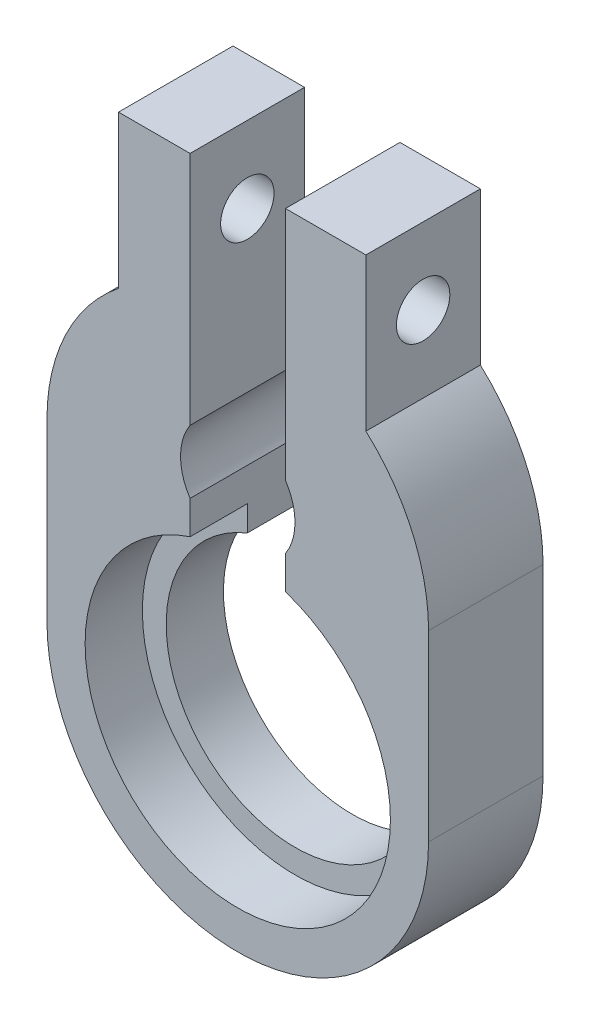
ISO-10303-21;
HEADER;
FILE_DESCRIPTION(('STEP AP214'),'2;1');
FILE_NAME('part.step','',(''),(''),'','','');
FILE_SCHEMA(('AUTOMOTIVE_DESIGN { 1 0 10303 214 1 1 1 1 }'));
ENDSEC;
DATA;
#1=APPLICATION_CONTEXT('core data for automotive mechanical design processes');
#2=APPLICATION_PROTOCOL_DEFINITION('international standard','automotive_design',2000,#1);
#3=PRODUCT_CONTEXT('',#1,'mechanical');
#4=PRODUCT('Part','Part','',(#3));
#5=PRODUCT_RELATED_PRODUCT_CATEGORY('part','',(#4));
#6=PRODUCT_DEFINITION_FORMATION('','',#4);
#7=PRODUCT_DEFINITION_CONTEXT('part definition',#1,'design');
#8=PRODUCT_DEFINITION('design','',#6,#7);
#9=PRODUCT_DEFINITION_SHAPE('','',#8);
#10=(LENGTH_UNIT() NAMED_UNIT(*) SI_UNIT(.MILLI.,.METRE.));
#11=(NAMED_UNIT(*) PLANE_ANGLE_UNIT() SI_UNIT($,.RADIAN.));
#12=(NAMED_UNIT(*) SI_UNIT($,.STERADIAN.) SOLID_ANGLE_UNIT());
#13=UNCERTAINTY_MEASURE_WITH_UNIT(LENGTH_MEASURE(1.E-05),#10,'distance_accuracy_value','');
#14=(GEOMETRIC_REPRESENTATION_CONTEXT(3) GLOBAL_UNCERTAINTY_ASSIGNED_CONTEXT((#13)) GLOBAL_UNIT_ASSIGNED_CONTEXT((#10,
#11,#12)) REPRESENTATION_CONTEXT('',''));
#15=CARTESIAN_POINT('',(0.,0.,0.));
#16=DIRECTION('',(0.,0.,1.));
#17=DIRECTION('',(1.,0.,0.));
#18=AXIS2_PLACEMENT_3D('',#15,#16,#17);
#19=CARTESIAN_POINT('',(0.,0.,6.));
#20=DIRECTION('',(0.,0.,-1.));
#21=DIRECTION('',(-1.,0.,0.));
#22=AXIS2_PLACEMENT_3D('',#19,#20,#21);
#23=CYLINDRICAL_SURFACE('',#22,6.75);
#24=CARTESIAN_POINT('',(0.,0.,3.));
#25=DIRECTION('',(0.,0.,1.));
#26=DIRECTION('',(1.,0.,0.));
#27=AXIS2_PLACEMENT_3D('',#24,#25,#26);
#28=CIRCLE('',#27,6.75);
#29=CARTESIAN_POINT('',(2.5,6.26996810199223,3.));
#30=VERTEX_POINT('',#29);
#31=CARTESIAN_POINT('',(-2.50000000000001,6.26996810199222,3.));
#32=VERTEX_POINT('',#31);
#33=EDGE_CURVE('E182',#30,#32,#28,.F.);
#34=ORIENTED_EDGE('',*,*,#33,.F.);
#35=DIRECTION('',(0.,0.,-1.));
#36=VECTOR('',#35,1.);
#37=CARTESIAN_POINT('',(2.5,6.26996810199223,6.));
#38=LINE('',#37,#36);
#39=CARTESIAN_POINT('',(2.5,6.26996810199223,0.));
#40=VERTEX_POINT('',#39);
#41=EDGE_CURVE('E196',#30,#40,#38,.T.);
#42=ORIENTED_EDGE('',*,*,#41,.T.);
#43=CARTESIAN_POINT('',(0.,0.,0.));
#44=DIRECTION('',(0.,0.,-1.));
#45=DIRECTION('',(1.,0.,0.));
#46=AXIS2_PLACEMENT_3D('',#43,#44,#45);
#47=CIRCLE('',#46,6.75);
#48=CARTESIAN_POINT('',(-2.5,6.26996810199222,0.));
#49=VERTEX_POINT('',#48);
#50=EDGE_CURVE('E268',#40,#49,#47,.T.);
#51=ORIENTED_EDGE('',*,*,#50,.T.);
#52=DIRECTION('',(0.,0.,-1.));
#53=VECTOR('',#52,1.);
#54=CARTESIAN_POINT('',(-2.5,6.26996810199222,6.));
#55=LINE('',#54,#53);
#56=EDGE_CURVE('E348',#32,#49,#55,.T.);
#57=ORIENTED_EDGE('',*,*,#56,.F.);
#58=EDGE_LOOP('',(#34,#42,#51,#57));
#59=FACE_BOUND('',#58,.T.);
#60=ADVANCED_FACE('F47',(#59),#23,.F.);
#61=CARTESIAN_POINT('',(0.,11.,6.));
#62=DIRECTION('',(0.,0.,-1.));
#63=DIRECTION('',(-1.,0.,0.));
#64=AXIS2_PLACEMENT_3D('',#61,#62,#63);
#65=CYLINDRICAL_SURFACE('',#64,3.);
#66=CARTESIAN_POINT('',(0.,11.,0.));
#67=DIRECTION('',(0.,0.,-1.));
#68=DIRECTION('',(1.,0.,0.));
#69=AXIS2_PLACEMENT_3D('',#66,#67,#68);
#70=CIRCLE('',#69,3.);
#71=CARTESIAN_POINT('',(2.49999999999999,12.6583123951777,0.));
#72=VERTEX_POINT('',#71);
#73=CARTESIAN_POINT('',(2.5,9.3416876048223,0.));
#74=VERTEX_POINT('',#73);
#75=EDGE_CURVE('E218',#72,#74,#70,.T.);
#76=ORIENTED_EDGE('',*,*,#75,.T.);
#77=DIRECTION('',(0.,0.,-1.));
#78=VECTOR('',#77,1.);
#79=CARTESIAN_POINT('',(2.5,9.3416876048223,6.));
#80=LINE('',#79,#78);
#81=CARTESIAN_POINT('',(2.5,9.3416876048223,6.));
#82=VERTEX_POINT('',#81);
#83=EDGE_CURVE('E353',#82,#74,#80,.T.);
#84=ORIENTED_EDGE('',*,*,#83,.F.);
#85=CARTESIAN_POINT('',(0.,11.,6.));
#86=DIRECTION('',(0.,0.,-1.));
#87=DIRECTION('',(1.,0.,0.));
#88=AXIS2_PLACEMENT_3D('',#85,#86,#87);
#89=CIRCLE('',#88,3.);
#90=CARTESIAN_POINT('',(2.49999999999999,12.6583123951777,6.));
#91=VERTEX_POINT('',#90);
#92=EDGE_CURVE('E219',#91,#82,#89,.T.);
#93=ORIENTED_EDGE('',*,*,#92,.F.);
#94=DIRECTION('',(0.,0.,-1.));
#95=VECTOR('',#94,1.);
#96=CARTESIAN_POINT('',(2.49999999999999,12.6583123951777,6.));
#97=LINE('',#96,#95);
#98=EDGE_CURVE('E261',#91,#72,#97,.T.);
#99=ORIENTED_EDGE('',*,*,#98,.T.);
#100=EDGE_LOOP('',(#76,#84,#93,#99));
#101=FACE_BOUND('',#100,.T.);
#102=ADVANCED_FACE('F420',(#101),#65,.F.);
#103=CARTESIAN_POINT('',(2.5,6.26996810199223,6.));
#104=DIRECTION('',(1.,0.,0.));
#105=DIRECTION('',(0.,0.,-1.));
#106=AXIS2_PLACEMENT_3D('',#103,#104,#105);
#107=PLANE('',#106);
#108=DIRECTION('',(0.,-1.,0.));
#109=VECTOR('',#108,1.);
#110=CARTESIAN_POINT('',(2.5,6.26996810199223,3.));
#111=LINE('',#110,#109);
#112=CARTESIAN_POINT('',(2.5,7.59934207678533,3.));
#113=VERTEX_POINT('',#112);
#114=EDGE_CURVE('E187',#113,#30,#111,.T.);
#115=ORIENTED_EDGE('',*,*,#114,.F.);
#116=DIRECTION('',(0.,0.,1.));
#117=VECTOR('',#116,1.);
#118=CARTESIAN_POINT('',(2.5,7.59934207678533,3.));
#119=LINE('',#118,#117);
#120=CARTESIAN_POINT('',(2.5,7.59934207678533,6.));
#121=VERTEX_POINT('',#120);
#122=EDGE_CURVE('E171',#113,#121,#119,.T.);
#123=ORIENTED_EDGE('',*,*,#122,.T.);
#124=DIRECTION('',(0.,-1.,0.));
#125=VECTOR('',#124,1.);
#126=CARTESIAN_POINT('',(2.5,6.26996810199223,6.));
#127=LINE('',#126,#125);
#128=EDGE_CURVE('E223',#82,#121,#127,.T.);
#129=ORIENTED_EDGE('',*,*,#128,.F.);
#130=ORIENTED_EDGE('',*,*,#83,.T.);
#131=DIRECTION('',(0.,-1.,0.));
#132=VECTOR('',#131,1.);
#133=CARTESIAN_POINT('',(2.5,6.26996810199223,0.));
#134=LINE('',#133,#132);
#135=EDGE_CURVE('E265',#74,#40,#134,.T.);
#136=ORIENTED_EDGE('',*,*,#135,.T.);
#137=ORIENTED_EDGE('',*,*,#41,.F.);
#138=EDGE_LOOP('',(#115,#123,#129,#130,#136,#137));
#139=FACE_BOUND('',#138,.T.);
#140=ADVANCED_FACE('F194',(#139),#107,.F.);
#141=CARTESIAN_POINT('',(-2.50000000000001,6.26996810199222,6.));
#142=DIRECTION('',(-1.,0.,0.));
#143=DIRECTION('',(0.,-1.,0.));
#144=AXIS2_PLACEMENT_3D('',#141,#142,#143);
#145=PLANE('',#144);
#146=DIRECTION('',(0.,1.,0.));
#147=VECTOR('',#146,1.);
#148=CARTESIAN_POINT('',(-2.50000000000001,6.26996810199222,6.));
#149=LINE('',#148,#147);
#150=CARTESIAN_POINT('',(-2.5,7.59934207678533,6.));
#151=VERTEX_POINT('',#150);
#152=CARTESIAN_POINT('',(-2.5,9.3416876048223,6.));
#153=VERTEX_POINT('',#152);
#154=EDGE_CURVE('E227',#151,#153,#149,.T.);
#155=ORIENTED_EDGE('',*,*,#154,.F.);
#156=DIRECTION('',(0.,0.,1.));
#157=VECTOR('',#156,1.);
#158=CARTESIAN_POINT('',(-2.5,7.59934207678533,3.));
#159=LINE('',#158,#157);
#160=CARTESIAN_POINT('',(-2.5,7.59934207678533,3.));
#161=VERTEX_POINT('',#160);
#162=EDGE_CURVE('E183',#151,#161,#159,.F.);
#163=ORIENTED_EDGE('',*,*,#162,.T.);
#164=DIRECTION('',(0.,1.,0.));
#165=VECTOR('',#164,1.);
#166=CARTESIAN_POINT('',(-2.50000000000001,6.26996810199222,3.));
#167=LINE('',#166,#165);
#168=EDGE_CURVE('E190',#32,#161,#167,.T.);
#169=ORIENTED_EDGE('',*,*,#168,.F.);
#170=ORIENTED_EDGE('',*,*,#56,.T.);
#171=DIRECTION('',(0.,1.,0.));
#172=VECTOR('',#171,1.);
#173=CARTESIAN_POINT('',(-2.50000000000001,6.26996810199222,0.));
#174=LINE('',#173,#172);
#175=CARTESIAN_POINT('',(-2.5,9.3416876048223,0.));
#176=VERTEX_POINT('',#175);
#177=EDGE_CURVE('E272',#49,#176,#174,.T.);
#178=ORIENTED_EDGE('',*,*,#177,.T.);
#179=DIRECTION('',(0.,0.,-1.));
#180=VECTOR('',#179,1.);
#181=CARTESIAN_POINT('',(-2.5,9.3416876048223,6.));
#182=LINE('',#181,#180);
#183=EDGE_CURVE('E344',#153,#176,#182,.T.);
#184=ORIENTED_EDGE('',*,*,#183,.F.);
#185=EDGE_LOOP('',(#155,#163,#169,#170,#178,#184));
#186=FACE_BOUND('',#185,.T.);
#187=ADVANCED_FACE('F425',(#186),#145,.F.);
#188=CARTESIAN_POINT('',(0.,11.,6.));
#189=DIRECTION('',(0.,0.,-1.));
#190=DIRECTION('',(-1.,0.,0.));
#191=AXIS2_PLACEMENT_3D('',#188,#189,#190);
#192=CYLINDRICAL_SURFACE('',#191,3.);
#193=CARTESIAN_POINT('',(0.,11.,0.));
#194=DIRECTION('',(0.,0.,-1.));
#195=DIRECTION('',(1.,0.,0.));
#196=AXIS2_PLACEMENT_3D('',#193,#194,#195);
#197=CIRCLE('',#196,3.);
#198=CARTESIAN_POINT('',(-2.50000000000001,12.6583123951777,0.));
#199=VERTEX_POINT('',#198);
#200=EDGE_CURVE('E275',#176,#199,#197,.T.);
#201=ORIENTED_EDGE('',*,*,#200,.T.);
#202=DIRECTION('',(0.,0.,-1.));
#203=VECTOR('',#202,1.);
#204=CARTESIAN_POINT('',(-2.50000000000001,12.6583123951777,6.));
#205=LINE('',#204,#203);
#206=CARTESIAN_POINT('',(-2.50000000000001,12.6583123951777,6.));
#207=VERTEX_POINT('',#206);
#208=EDGE_CURVE('E340',#207,#199,#205,.T.);
#209=ORIENTED_EDGE('',*,*,#208,.F.);
#210=CARTESIAN_POINT('',(0.,11.,6.));
#211=DIRECTION('',(0.,0.,-1.));
#212=DIRECTION('',(1.,0.,0.));
#213=AXIS2_PLACEMENT_3D('',#210,#211,#212);
#214=CIRCLE('',#213,3.);
#215=EDGE_CURVE('E230',#153,#207,#214,.T.);
#216=ORIENTED_EDGE('',*,*,#215,.F.);
#217=ORIENTED_EDGE('',*,*,#183,.T.);
#218=EDGE_LOOP('',(#201,#209,#216,#217));
#219=FACE_BOUND('',#218,.T.);
#220=ADVANCED_FACE('F431',(#219),#192,.F.);
#221=CARTESIAN_POINT('',(-2.50000000000001,12.6583123951777,6.));
#222=DIRECTION('',(-1.,0.,0.));
#223=DIRECTION('',(0.,0.,1.));
#224=AXIS2_PLACEMENT_3D('',#221,#222,#223);
#225=PLANE('',#224);
#226=CARTESIAN_POINT('',(-2.50000000000001,21.,3.));
#227=DIRECTION('',(-1.,0.,0.));
#228=DIRECTION('',(0.,0.,1.));
#229=AXIS2_PLACEMENT_3D('',#226,#227,#228);
#230=CIRCLE('',#229,1.4);
#231=CARTESIAN_POINT('',(-2.50000000000001,21.,1.6));
#232=VERTEX_POINT('',#231);
#233=EDGE_CURVE('E214',#232,#232,#230,.T.);
#234=ORIENTED_EDGE('',*,*,#233,.T.);
#235=EDGE_LOOP('',(#234));
#236=FACE_BOUND('',#235,.T.);
#237=DIRECTION('',(0.,1.,0.));
#238=VECTOR('',#237,1.);
#239=CARTESIAN_POINT('',(-2.50000000000001,12.6583123951777,0.));
#240=LINE('',#239,#238);
#241=CARTESIAN_POINT('',(-2.50000000000001,25.,0.));
#242=VERTEX_POINT('',#241);
#243=EDGE_CURVE('E278',#199,#242,#240,.T.);
#244=ORIENTED_EDGE('',*,*,#243,.T.);
#245=DIRECTION('',(0.,0.,-1.));
#246=VECTOR('',#245,1.);
#247=CARTESIAN_POINT('',(-2.50000000000001,25.,6.));
#248=LINE('',#247,#246);
#249=CARTESIAN_POINT('',(-2.50000000000001,25.,6.));
#250=VERTEX_POINT('',#249);
#251=EDGE_CURVE('E336',#250,#242,#248,.T.);
#252=ORIENTED_EDGE('',*,*,#251,.F.);
#253=DIRECTION('',(0.,1.,0.));
#254=VECTOR('',#253,1.);
#255=CARTESIAN_POINT('',(-2.50000000000001,12.6583123951777,6.));
#256=LINE('',#255,#254);
#257=EDGE_CURVE('E233',#207,#250,#256,.T.);
#258=ORIENTED_EDGE('',*,*,#257,.F.);
#259=ORIENTED_EDGE('',*,*,#208,.T.);
#260=EDGE_LOOP('',(#244,#252,#258,#259));
#261=FACE_BOUND('',#260,.T.);
#262=ADVANCED_FACE('F436',(#236,#261),#225,.F.);
#263=CARTESIAN_POINT('',(-6.25000000000003,25.,6.));
#264=DIRECTION('',(0.,-1.,0.));
#265=DIRECTION('',(0.,0.,-1.));
#266=AXIS2_PLACEMENT_3D('',#263,#264,#265);
#267=PLANE('',#266);
#268=DIRECTION('',(-1.,0.,0.));
#269=VECTOR('',#268,1.);
#270=CARTESIAN_POINT('',(-6.25000000000003,25.,0.));
#271=LINE('',#270,#269);
#272=CARTESIAN_POINT('',(-6.25000000000003,25.,0.));
#273=VERTEX_POINT('',#272);
#274=EDGE_CURVE('E281',#242,#273,#271,.T.);
#275=ORIENTED_EDGE('',*,*,#274,.T.);
#276=DIRECTION('',(0.,0.,-1.));
#277=VECTOR('',#276,1.);
#278=CARTESIAN_POINT('',(-6.25000000000003,25.,6.));
#279=LINE('',#278,#277);
#280=CARTESIAN_POINT('',(-6.25000000000003,25.,6.));
#281=VERTEX_POINT('',#280);
#282=EDGE_CURVE('E332',#281,#273,#279,.T.);
#283=ORIENTED_EDGE('',*,*,#282,.F.);
#284=DIRECTION('',(-1.,0.,0.));
#285=VECTOR('',#284,1.);
#286=CARTESIAN_POINT('',(-6.25000000000003,25.,6.));
#287=LINE('',#286,#285);
#288=EDGE_CURVE('E236',#250,#281,#287,.T.);
#289=ORIENTED_EDGE('',*,*,#288,.F.);
#290=ORIENTED_EDGE('',*,*,#251,.T.);
#291=EDGE_LOOP('',(#275,#283,#289,#290));
#292=FACE_BOUND('',#291,.T.);
#293=ADVANCED_FACE('F439',(#292),#267,.F.);
#294=CARTESIAN_POINT('',(-6.25000000000003,25.,6.));
#295=DIRECTION('',(1.,0.,0.));
#296=DIRECTION('',(0.,1.,0.));
#297=AXIS2_PLACEMENT_3D('',#294,#295,#296);
#298=PLANE('',#297);
#299=CARTESIAN_POINT('',(-6.25000000000003,21.,3.));
#300=DIRECTION('',(1.,0.,0.));
#301=DIRECTION('',(0.,1.,0.));
#302=AXIS2_PLACEMENT_3D('',#299,#300,#301);
#303=CIRCLE('',#302,1.4);
#304=CARTESIAN_POINT('',(-6.25000000000003,21.,1.6));
#305=VERTEX_POINT('',#304);
#306=EDGE_CURVE('E210',#305,#305,#303,.T.);
#307=ORIENTED_EDGE('',*,*,#306,.T.);
#308=EDGE_LOOP('',(#307));
#309=FACE_BOUND('',#308,.T.);
#310=DIRECTION('',(0.,-1.,0.));
#311=VECTOR('',#310,1.);
#312=CARTESIAN_POINT('',(-6.25000000000003,25.,0.));
#313=LINE('',#312,#311);
#314=CARTESIAN_POINT('',(-6.25000000000003,17.,0.));
#315=VERTEX_POINT('',#314);
#316=EDGE_CURVE('E284',#273,#315,#313,.T.);
#317=ORIENTED_EDGE('',*,*,#316,.T.);
#318=DIRECTION('',(0.,0.,-1.));
#319=VECTOR('',#318,1.);
#320=CARTESIAN_POINT('',(-6.25000000000003,17.,6.));
#321=LINE('',#320,#319);
#322=CARTESIAN_POINT('',(-6.25000000000003,17.,6.));
#323=VERTEX_POINT('',#322);
#324=EDGE_CURVE('E329',#323,#315,#321,.T.);
#325=ORIENTED_EDGE('',*,*,#324,.F.);
#326=DIRECTION('',(0.,-1.,0.));
#327=VECTOR('',#326,1.);
#328=CARTESIAN_POINT('',(-6.25000000000003,25.,6.));
#329=LINE('',#328,#327);
#330=EDGE_CURVE('E239',#281,#323,#329,.T.);
#331=ORIENTED_EDGE('',*,*,#330,.F.);
#332=ORIENTED_EDGE('',*,*,#282,.T.);
#333=EDGE_LOOP('',(#317,#325,#331,#332));
#334=FACE_BOUND('',#333,.T.);
#335=ADVANCED_FACE('F381',(#309,#334),#298,.F.);
#336=CARTESIAN_POINT('',(-10.,0.,6.));
#337=DIRECTION('',(1.,0.,0.));
#338=DIRECTION('',(0.,1.,0.));
#339=AXIS2_PLACEMENT_3D('',#336,#337,#338);
#340=PLANE('',#339);
#341=DIRECTION('',(0.,-1.,0.));
#342=VECTOR('',#341,1.);
#343=CARTESIAN_POINT('',(-10.,0.,6.));
#344=LINE('',#343,#342);
#345=CARTESIAN_POINT('',(-10.,9.19375250200202,6.));
#346=VERTEX_POINT('',#345);
#347=CARTESIAN_POINT('',(-10.,0.,6.));
#348=VERTEX_POINT('',#347);
#349=EDGE_CURVE('E242',#346,#348,#344,.T.);
#350=ORIENTED_EDGE('',*,*,#349,.F.);
#351=DIRECTION('',(0.,0.,1.));
#352=VECTOR('',#351,1.);
#353=CARTESIAN_POINT('',(-10.,9.19375250200202,6.));
#354=LINE('',#353,#352);
#355=CARTESIAN_POINT('',(-10.,9.19375250200202,0.));
#356=VERTEX_POINT('',#355);
#357=EDGE_CURVE('E370',#346,#356,#354,.F.);
#358=ORIENTED_EDGE('',*,*,#357,.T.);
#359=DIRECTION('',(0.,-1.,0.));
#360=VECTOR('',#359,1.);
#361=CARTESIAN_POINT('',(-10.,0.,0.));
#362=LINE('',#361,#360);
#363=CARTESIAN_POINT('',(-10.,0.,0.));
#364=VERTEX_POINT('',#363);
#365=EDGE_CURVE('E288',#356,#364,#362,.T.);
#366=ORIENTED_EDGE('',*,*,#365,.T.);
#367=DIRECTION('',(0.,0.,-1.));
#368=VECTOR('',#367,1.);
#369=CARTESIAN_POINT('',(-10.,0.,6.));
#370=LINE('',#369,#368);
#371=EDGE_CURVE('E325',#348,#364,#370,.T.);
#372=ORIENTED_EDGE('',*,*,#371,.F.);
#373=EDGE_LOOP('',(#350,#358,#366,#372));
#374=FACE_BOUND('',#373,.T.);
#375=ADVANCED_FACE('F385',(#374),#340,.F.);
#376=CARTESIAN_POINT('',(0.,0.,6.));
#377=DIRECTION('',(0.,0.,-1.));
#378=DIRECTION('',(-1.,0.,0.));
#379=AXIS2_PLACEMENT_3D('',#376,#377,#378);
#380=CYLINDRICAL_SURFACE('',#379,10.);
#381=CARTESIAN_POINT('',(0.,0.,0.));
#382=DIRECTION('',(0.,0.,1.));
#383=DIRECTION('',(1.,0.,0.));
#384=AXIS2_PLACEMENT_3D('',#381,#382,#383);
#385=CIRCLE('',#384,10.);
#386=CARTESIAN_POINT('',(10.,0.,0.));
#387=VERTEX_POINT('',#386);
#388=EDGE_CURVE('E291',#364,#387,#385,.T.);
#389=ORIENTED_EDGE('',*,*,#388,.T.);
#390=DIRECTION('',(0.,0.,-1.));
#391=VECTOR('',#390,1.);
#392=CARTESIAN_POINT('',(10.,0.,6.));
#393=LINE('',#392,#391);
#394=CARTESIAN_POINT('',(10.,0.,6.));
#395=VERTEX_POINT('',#394);
#396=EDGE_CURVE('E321',#395,#387,#393,.T.);
#397=ORIENTED_EDGE('',*,*,#396,.F.);
#398=CARTESIAN_POINT('',(0.,0.,6.));
#399=DIRECTION('',(0.,0.,1.));
#400=DIRECTION('',(1.,0.,0.));
#401=AXIS2_PLACEMENT_3D('',#398,#399,#400);
#402=CIRCLE('',#401,10.);
#403=EDGE_CURVE('E245',#348,#395,#402,.T.);
#404=ORIENTED_EDGE('',*,*,#403,.F.);
#405=ORIENTED_EDGE('',*,*,#371,.T.);
#406=EDGE_LOOP('',(#389,#397,#404,#405));
#407=FACE_BOUND('',#406,.T.);
#408=ADVANCED_FACE('F393',(#407),#380,.T.);
#409=CARTESIAN_POINT('',(9.99999999999999,17.,6.));
#410=DIRECTION('',(-1.,0.,0.));
#411=DIRECTION('',(0.,-1.,0.));
#412=AXIS2_PLACEMENT_3D('',#409,#410,#411);
#413=PLANE('',#412);
#414=DIRECTION('',(0.,1.,0.));
#415=VECTOR('',#414,1.);
#416=CARTESIAN_POINT('',(9.99999999999999,17.,0.));
#417=LINE('',#416,#415);
#418=CARTESIAN_POINT('',(10.,9.59052216892149,0.));
#419=VERTEX_POINT('',#418);
#420=EDGE_CURVE('E294',#387,#419,#417,.T.);
#421=ORIENTED_EDGE('',*,*,#420,.T.);
#422=DIRECTION('',(0.,0.,-1.));
#423=VECTOR('',#422,1.);
#424=CARTESIAN_POINT('',(10.,9.59052216892149,6.));
#425=LINE('',#424,#423);
#426=CARTESIAN_POINT('',(10.,9.59052216892149,6.));
#427=VERTEX_POINT('',#426);
#428=EDGE_CURVE('E364',#419,#427,#425,.F.);
#429=ORIENTED_EDGE('',*,*,#428,.T.);
#430=DIRECTION('',(0.,1.,0.));
#431=VECTOR('',#430,1.);
#432=CARTESIAN_POINT('',(9.99999999999999,17.,6.));
#433=LINE('',#432,#431);
#434=EDGE_CURVE('E248',#395,#427,#433,.T.);
#435=ORIENTED_EDGE('',*,*,#434,.F.);
#436=ORIENTED_EDGE('',*,*,#396,.T.);
#437=EDGE_LOOP('',(#421,#429,#435,#436));
#438=FACE_BOUND('',#437,.T.);
#439=ADVANCED_FACE('F396',(#438),#413,.F.);
#440=CARTESIAN_POINT('',(6.71562642429997,25.,6.));
#441=DIRECTION('',(-1.,0.,0.));
#442=DIRECTION('',(0.,0.,1.));
#443=AXIS2_PLACEMENT_3D('',#440,#441,#442);
#444=PLANE('',#443);
#445=CARTESIAN_POINT('',(6.71562642429997,21.,3.));
#446=DIRECTION('',(-1.,0.,0.));
#447=DIRECTION('',(0.,0.,1.));
#448=AXIS2_PLACEMENT_3D('',#445,#446,#447);
#449=CIRCLE('',#448,1.4);
#450=CARTESIAN_POINT('',(6.71562642429998,21.,1.6));
#451=VERTEX_POINT('',#450);
#452=EDGE_CURVE('E203',#451,#451,#449,.T.);
#453=ORIENTED_EDGE('',*,*,#452,.T.);
#454=EDGE_LOOP('',(#453));
#455=FACE_BOUND('',#454,.T.);
#456=DIRECTION('',(0.,1.,0.));
#457=VECTOR('',#456,1.);
#458=CARTESIAN_POINT('',(6.71562642429997,25.,0.));
#459=LINE('',#458,#457);
#460=CARTESIAN_POINT('',(6.71562642429997,17.,0.));
#461=VERTEX_POINT('',#460);
#462=CARTESIAN_POINT('',(6.71562642429997,25.,0.));
#463=VERTEX_POINT('',#462);
#464=EDGE_CURVE('E298',#461,#463,#459,.T.);
#465=ORIENTED_EDGE('',*,*,#464,.T.);
#466=DIRECTION('',(0.,0.,-1.));
#467=VECTOR('',#466,1.);
#468=CARTESIAN_POINT('',(6.71562642429997,25.,6.));
#469=LINE('',#468,#467);
#470=CARTESIAN_POINT('',(6.71562642429997,25.,6.));
#471=VERTEX_POINT('',#470);
#472=EDGE_CURVE('E313',#471,#463,#469,.T.);
#473=ORIENTED_EDGE('',*,*,#472,.F.);
#474=DIRECTION('',(0.,1.,0.));
#475=VECTOR('',#474,1.);
#476=CARTESIAN_POINT('',(6.71562642429997,25.,6.));
#477=LINE('',#476,#475);
#478=CARTESIAN_POINT('',(6.71562642429997,17.,6.));
#479=VERTEX_POINT('',#478);
#480=EDGE_CURVE('E252',#479,#471,#477,.T.);
#481=ORIENTED_EDGE('',*,*,#480,.F.);
#482=DIRECTION('',(0.,0.,-1.));
#483=VECTOR('',#482,1.);
#484=CARTESIAN_POINT('',(6.71562642429997,17.,6.));
#485=LINE('',#484,#483);
#486=EDGE_CURVE('E317',#479,#461,#485,.T.);
#487=ORIENTED_EDGE('',*,*,#486,.T.);
#488=EDGE_LOOP('',(#465,#473,#481,#487));
#489=FACE_BOUND('',#488,.T.);
#490=ADVANCED_FACE('F404',(#455,#489),#444,.F.);
#491=CARTESIAN_POINT('',(2.49999999999999,25.,6.));
#492=DIRECTION('',(0.,-1.,0.));
#493=DIRECTION('',(1.,0.,0.));
#494=AXIS2_PLACEMENT_3D('',#491,#492,#493);
#495=PLANE('',#494);
#496=DIRECTION('',(-1.,0.,0.));
#497=VECTOR('',#496,1.);
#498=CARTESIAN_POINT('',(2.49999999999999,25.,0.));
#499=LINE('',#498,#497);
#500=CARTESIAN_POINT('',(2.49999999999999,25.,0.));
#501=VERTEX_POINT('',#500);
#502=EDGE_CURVE('E301',#463,#501,#499,.T.);
#503=ORIENTED_EDGE('',*,*,#502,.T.);
#504=DIRECTION('',(0.,0.,-1.));
#505=VECTOR('',#504,1.);
#506=CARTESIAN_POINT('',(2.49999999999999,25.,6.));
#507=LINE('',#506,#505);
#508=CARTESIAN_POINT('',(2.49999999999999,25.,6.));
#509=VERTEX_POINT('',#508);
#510=EDGE_CURVE('E309',#509,#501,#507,.T.);
#511=ORIENTED_EDGE('',*,*,#510,.F.);
#512=DIRECTION('',(-1.,0.,0.));
#513=VECTOR('',#512,1.);
#514=CARTESIAN_POINT('',(2.49999999999999,25.,6.));
#515=LINE('',#514,#513);
#516=EDGE_CURVE('E255',#471,#509,#515,.T.);
#517=ORIENTED_EDGE('',*,*,#516,.F.);
#518=ORIENTED_EDGE('',*,*,#472,.T.);
#519=EDGE_LOOP('',(#503,#511,#517,#518));
#520=FACE_BOUND('',#519,.T.);
#521=ADVANCED_FACE('F410',(#520),#495,.F.);
#522=CARTESIAN_POINT('',(2.49999999999999,12.6583123951777,6.));
#523=DIRECTION('',(1.,0.,0.));
#524=DIRECTION('',(0.,0.,-1.));
#525=AXIS2_PLACEMENT_3D('',#522,#523,#524);
#526=PLANE('',#525);
#527=CARTESIAN_POINT('',(2.49999999999999,21.,3.));
#528=DIRECTION('',(1.,0.,0.));
#529=DIRECTION('',(0.,0.,-1.));
#530=AXIS2_PLACEMENT_3D('',#527,#528,#529);
#531=CIRCLE('',#530,1.4);
#532=CARTESIAN_POINT('',(2.49999999999999,21.,1.6));
#533=VERTEX_POINT('',#532);
#534=EDGE_CURVE('E198',#533,#533,#531,.T.);
#535=ORIENTED_EDGE('',*,*,#534,.T.);
#536=EDGE_LOOP('',(#535));
#537=FACE_BOUND('',#536,.T.);
#538=DIRECTION('',(0.,-1.,0.));
#539=VECTOR('',#538,1.);
#540=CARTESIAN_POINT('',(2.49999999999999,12.6583123951777,0.));
#541=LINE('',#540,#539);
#542=EDGE_CURVE('E224',#501,#72,#541,.T.);
#543=ORIENTED_EDGE('',*,*,#542,.T.);
#544=ORIENTED_EDGE('',*,*,#98,.F.);
#545=DIRECTION('',(0.,-1.,0.));
#546=VECTOR('',#545,1.);
#547=CARTESIAN_POINT('',(2.49999999999999,12.6583123951777,6.));
#548=LINE('',#547,#546);
#549=EDGE_CURVE('E258',#509,#91,#548,.T.);
#550=ORIENTED_EDGE('',*,*,#549,.F.);
#551=ORIENTED_EDGE('',*,*,#510,.T.);
#552=EDGE_LOOP('',(#543,#544,#550,#551));
#553=FACE_BOUND('',#552,.T.);
#554=ADVANCED_FACE('F416',(#537,#553),#526,.F.);
#555=CARTESIAN_POINT('',(0.,11.,6.));
#556=DIRECTION('',(0.,0.,1.));
#557=DIRECTION('',(1.,0.,0.));
#558=AXIS2_PLACEMENT_3D('',#555,#556,#557);
#559=PLANE('',#558);
#560=ORIENTED_EDGE('',*,*,#330,.T.);
#561=CARTESIAN_POINT('',(0.,9.19375250200203,6.));
#562=DIRECTION('',(0.,0.,1.));
#563=DIRECTION('',(1.,0.,0.));
#564=AXIS2_PLACEMENT_3D('',#561,#562,#563);
#565=CIRCLE('',#564,10.);
#566=EDGE_CURVE('E12',#323,#346,#565,.T.);
#567=ORIENTED_EDGE('',*,*,#566,.T.);
#568=ORIENTED_EDGE('',*,*,#349,.T.);
#569=ORIENTED_EDGE('',*,*,#403,.T.);
#570=ORIENTED_EDGE('',*,*,#434,.T.);
#571=CARTESIAN_POINT('',(0.,9.59052216892149,6.));
#572=DIRECTION('',(0.,0.,1.));
#573=DIRECTION('',(1.,0.,0.));
#574=AXIS2_PLACEMENT_3D('',#571,#572,#573);
#575=CIRCLE('',#574,10.);
#576=EDGE_CURVE('E367',#427,#479,#575,.T.);
#577=ORIENTED_EDGE('',*,*,#576,.T.);
#578=ORIENTED_EDGE('',*,*,#480,.T.);
#579=ORIENTED_EDGE('',*,*,#516,.T.);
#580=ORIENTED_EDGE('',*,*,#549,.T.);
#581=ORIENTED_EDGE('',*,*,#92,.T.);
#582=ORIENTED_EDGE('',*,*,#128,.T.);
#583=CARTESIAN_POINT('',(0.,0.,6.));
#584=DIRECTION('',(0.,0.,1.));
#585=DIRECTION('',(1.,0.,0.));
#586=AXIS2_PLACEMENT_3D('',#583,#584,#585);
#587=CIRCLE('',#586,8.);
#588=EDGE_CURVE('E177',#151,#121,#587,.T.);
#589=ORIENTED_EDGE('',*,*,#588,.F.);
#590=ORIENTED_EDGE('',*,*,#154,.T.);
#591=ORIENTED_EDGE('',*,*,#215,.T.);
#592=ORIENTED_EDGE('',*,*,#257,.T.);
#593=ORIENTED_EDGE('',*,*,#288,.T.);
#594=EDGE_LOOP('',(#560,#567,#568,#569,#570,#577,#578,#579,#580,#581,#582,#589,#590,#591,#592,#593));
#595=FACE_BOUND('',#594,.T.);
#596=ADVANCED_FACE('F388',(#595),#559,.T.);
#597=CARTESIAN_POINT('',(0.,11.,0.));
#598=DIRECTION('',(0.,0.,1.));
#599=DIRECTION('',(1.,0.,0.));
#600=AXIS2_PLACEMENT_3D('',#597,#598,#599);
#601=PLANE('',#600);
#602=ORIENTED_EDGE('',*,*,#365,.F.);
#603=CARTESIAN_POINT('',(0.,9.19375250200203,0.));
#604=DIRECTION('',(0.,0.,1.));
#605=DIRECTION('',(1.,0.,0.));
#606=AXIS2_PLACEMENT_3D('',#603,#604,#605);
#607=CIRCLE('',#606,10.);
#608=EDGE_CURVE('E56',#356,#315,#607,.F.);
#609=ORIENTED_EDGE('',*,*,#608,.T.);
#610=ORIENTED_EDGE('',*,*,#316,.F.);
#611=ORIENTED_EDGE('',*,*,#274,.F.);
#612=ORIENTED_EDGE('',*,*,#243,.F.);
#613=ORIENTED_EDGE('',*,*,#200,.F.);
#614=ORIENTED_EDGE('',*,*,#177,.F.);
#615=ORIENTED_EDGE('',*,*,#50,.F.);
#616=ORIENTED_EDGE('',*,*,#135,.F.);
#617=ORIENTED_EDGE('',*,*,#75,.F.);
#618=ORIENTED_EDGE('',*,*,#542,.F.);
#619=ORIENTED_EDGE('',*,*,#502,.F.);
#620=ORIENTED_EDGE('',*,*,#464,.F.);
#621=CARTESIAN_POINT('',(0.,9.59052216892149,0.));
#622=DIRECTION('',(0.,0.,1.));
#623=DIRECTION('',(1.,0.,0.));
#624=AXIS2_PLACEMENT_3D('',#621,#622,#623);
#625=CIRCLE('',#624,10.);
#626=EDGE_CURVE('E361',#461,#419,#625,.F.);
#627=ORIENTED_EDGE('',*,*,#626,.T.);
#628=ORIENTED_EDGE('',*,*,#420,.F.);
#629=ORIENTED_EDGE('',*,*,#388,.F.);
#630=EDGE_LOOP('',(#602,#609,#610,#611,#612,#613,#614,#615,#616,#617,#618,#619,#620,#627,#628,#629));
#631=FACE_BOUND('',#630,.T.);
#632=ADVANCED_FACE('F376',(#631),#601,.F.);
#633=CARTESIAN_POINT('',(-20.,21.,3.));
#634=DIRECTION('',(1.,0.,0.));
#635=DIRECTION('',(0.,0.,-1.));
#636=AXIS2_PLACEMENT_3D('',#633,#634,#635);
#637=CYLINDRICAL_SURFACE('',#636,1.4);
#638=CARTESIAN_POINT('',(2.49999999999999,21.,1.6));
#639=CARTESIAN_POINT('',(2.54391277525312,21.,1.6));
#640=CARTESIAN_POINT('',(2.58782555050624,21.,1.6));
#641=CARTESIAN_POINT('',(2.67565110101249,21.,1.6));
#642=CARTESIAN_POINT('',(2.71956387626561,21.,1.6));
#643=CARTESIAN_POINT('',(2.80738942677186,21.,1.6));
#644=CARTESIAN_POINT('',(2.85130220202499,21.,1.6));
#645=CARTESIAN_POINT('',(2.93912775253124,21.,1.6));
#646=CARTESIAN_POINT('',(2.98304052778437,21.,1.6));
#647=CARTESIAN_POINT('',(3.07086607829061,21.,1.6));
#648=CARTESIAN_POINT('',(3.11477885354374,21.,1.6));
#649=CARTESIAN_POINT('',(3.20260440404999,21.,1.6));
#650=CARTESIAN_POINT('',(3.24651717930311,21.,1.6));
#651=CARTESIAN_POINT('',(3.33434272980936,21.,1.6));
#652=CARTESIAN_POINT('',(3.37825550506249,21.,1.6));
#653=CARTESIAN_POINT('',(3.46608105556874,21.,1.6));
#654=CARTESIAN_POINT('',(3.50999383082186,21.,1.6));
#655=CARTESIAN_POINT('',(3.59781938132811,21.,1.6));
#656=CARTESIAN_POINT('',(3.64173215658124,21.,1.6));
#657=CARTESIAN_POINT('',(3.72955770708749,21.,1.6));
#658=CARTESIAN_POINT('',(3.77347048234061,21.,1.6));
#659=CARTESIAN_POINT('',(3.86129603284686,21.,1.6));
#660=CARTESIAN_POINT('',(3.90520880809999,21.,1.6));
#661=CARTESIAN_POINT('',(3.99303435860624,21.,1.6));
#662=CARTESIAN_POINT('',(4.03694713385936,21.,1.6));
#663=CARTESIAN_POINT('',(4.12477268436561,21.,1.6));
#664=CARTESIAN_POINT('',(4.16868545961874,21.,1.6));
#665=CARTESIAN_POINT('',(4.25651101012499,21.,1.6));
#666=CARTESIAN_POINT('',(4.30042378537811,21.,1.6));
#667=CARTESIAN_POINT('',(4.38824933588436,21.,1.6));
#668=CARTESIAN_POINT('',(4.43216211113749,21.,1.6));
#669=CARTESIAN_POINT('',(4.51998766164373,21.,1.6));
#670=CARTESIAN_POINT('',(4.56390043689686,21.,1.6));
#671=CARTESIAN_POINT('',(4.65172598740311,21.,1.6));
#672=CARTESIAN_POINT('',(4.69563876265623,21.,1.6));
#673=CARTESIAN_POINT('',(4.78346431316248,21.,1.6));
#674=CARTESIAN_POINT('',(4.82737708841561,21.,1.6));
#675=CARTESIAN_POINT('',(4.91520263892186,21.,1.6));
#676=CARTESIAN_POINT('',(4.95911541417498,21.,1.6));
#677=CARTESIAN_POINT('',(5.04694096468123,21.,1.6));
#678=CARTESIAN_POINT('',(5.09085373993436,21.,1.6));
#679=CARTESIAN_POINT('',(5.17867929044061,21.,1.6));
#680=CARTESIAN_POINT('',(5.22259206569373,21.,1.6));
#681=CARTESIAN_POINT('',(5.31041761619998,21.,1.6));
#682=CARTESIAN_POINT('',(5.35433039145311,21.,1.6));
#683=CARTESIAN_POINT('',(5.44215594195936,21.,1.6));
#684=CARTESIAN_POINT('',(5.48606871721248,21.,1.6));
#685=CARTESIAN_POINT('',(5.57389426771873,21.,1.6));
#686=CARTESIAN_POINT('',(5.61780704297186,21.,1.6));
#687=CARTESIAN_POINT('',(5.7056325934781,21.,1.6));
#688=CARTESIAN_POINT('',(5.74954536873123,21.,1.6));
#689=CARTESIAN_POINT('',(5.83737091923748,21.,1.6));
#690=CARTESIAN_POINT('',(5.8812836944906,21.,1.6));
#691=CARTESIAN_POINT('',(5.96910924499685,21.,1.6));
#692=CARTESIAN_POINT('',(6.01302202024998,21.,1.6));
#693=CARTESIAN_POINT('',(6.10084757075623,21.,1.6));
#694=CARTESIAN_POINT('',(6.14476034600935,21.,1.6));
#695=CARTESIAN_POINT('',(6.2325858965156,21.,1.6));
#696=CARTESIAN_POINT('',(6.27649867176873,21.,1.6));
#697=CARTESIAN_POINT('',(6.36432422227498,21.,1.6));
#698=CARTESIAN_POINT('',(6.4082369975281,21.,1.6));
#699=CARTESIAN_POINT('',(6.49606254803435,21.,1.6));
#700=CARTESIAN_POINT('',(6.53997532328748,21.,1.6));
#701=CARTESIAN_POINT('',(6.62780087379373,21.,1.6));
#702=CARTESIAN_POINT('',(6.67171364904685,21.,1.6));
#703=CARTESIAN_POINT('',(6.71562642429998,21.,1.6));
#704=B_SPLINE_CURVE_WITH_KNOTS('',3,(#638,#639,#640,#641,#642,#643,#644,#645,#646,#647,#648,
#649,#650,#651,#652,#653,#654,#655,#656,#657,#658,#659,#660,#661,#662,#663,#664,#665,#666,#667,
#668,#669,#670,#671,#672,#673,#674,#675,#676,#677,#678,#679,#680,#681,#682,#683,#684,#685,#686,
#687,#688,#689,#690,#691,#692,#693,#694,#695,#696,#697,#698,#699,#700,#701,#702,#703),
.UNSPECIFIED.,.F.,.F.,(4,2,2,2,2,2,2,2,2,2,2,2,2,2,2,2,2,2,2,2,2,2,2,2,2,2,2,2,2,2,2,2,4),(0.,
0.131738325759374,0.263476651518747,0.395214977278124,0.526953303037498,0.658691628796872,
0.790429954556249,0.922168280315622,1.053906606075,1.18564493183437,1.31738325759374,
1.44912158335312,1.58085990911249,1.71259823487187,1.84433656063124,1.97607488639062,
2.10781321214999,2.23955153790937,2.37128986366874,2.50302818942812,2.63476651518749,
2.76650484094686,2.89824316670624,3.02998149246561,3.16171981822499,3.29345814398436,
3.42519646974374,3.55693479550311,3.68867312126249,3.82041144702186,3.95214977278124,
4.08388809854061,4.21562642429998),.UNSPECIFIED.);
#705=EDGE_CURVE('BSEAM469',#533,#451,#704,.T.);
#706=ORIENTED_EDGE('',*,*,#534,.F.);
#707=ORIENTED_EDGE('',*,*,#452,.F.);
#708=ORIENTED_EDGE('',*,*,#705,.T.);
#709=ORIENTED_EDGE('',*,*,#705,.F.);
#710=EDGE_LOOP('',(#706,#708,#707,#709));
#711=FACE_BOUND('',#710,.T.);
#712=ADVANCED_FACE('F469',(#711),#637,.F.);
#713=CARTESIAN_POINT('',(-6.25000000000003,21.,1.6));
#714=CARTESIAN_POINT('',(-6.21093750000003,21.,1.6));
#715=CARTESIAN_POINT('',(-6.17187500000003,21.,1.6));
#716=CARTESIAN_POINT('',(-6.09375000000003,21.,1.6));
#717=CARTESIAN_POINT('',(-6.05468750000003,21.,1.6));
#718=CARTESIAN_POINT('',(-5.97656250000003,21.,1.6));
#719=CARTESIAN_POINT('',(-5.93750000000002,21.,1.6));
#720=CARTESIAN_POINT('',(-5.85937500000002,21.,1.6));
#721=CARTESIAN_POINT('',(-5.82031250000002,21.,1.6));
#722=CARTESIAN_POINT('',(-5.74218750000002,21.,1.6));
#723=CARTESIAN_POINT('',(-5.70312500000002,21.,1.6));
#724=CARTESIAN_POINT('',(-5.62500000000002,21.,1.6));
#725=CARTESIAN_POINT('',(-5.58593750000002,21.,1.6));
#726=CARTESIAN_POINT('',(-5.50781250000002,21.,1.6));
#727=CARTESIAN_POINT('',(-5.46875000000002,21.,1.6));
#728=CARTESIAN_POINT('',(-5.39062500000002,21.,1.6));
#729=CARTESIAN_POINT('',(-5.35156250000002,21.,1.6));
#730=CARTESIAN_POINT('',(-5.27343750000002,21.,1.6));
#731=CARTESIAN_POINT('',(-5.23437500000002,21.,1.6));
#732=CARTESIAN_POINT('',(-5.15625000000002,21.,1.6));
#733=CARTESIAN_POINT('',(-5.11718750000002,21.,1.6));
#734=CARTESIAN_POINT('',(-5.03906250000002,21.,1.6));
#735=CARTESIAN_POINT('',(-5.00000000000002,21.,1.6));
#736=CARTESIAN_POINT('',(-4.92187500000002,21.,1.6));
#737=CARTESIAN_POINT('',(-4.88281250000002,21.,1.6));
#738=CARTESIAN_POINT('',(-4.80468750000002,21.,1.6));
#739=CARTESIAN_POINT('',(-4.76562500000002,21.,1.6));
#740=CARTESIAN_POINT('',(-4.68750000000002,21.,1.6));
#741=CARTESIAN_POINT('',(-4.64843750000002,21.,1.6));
#742=CARTESIAN_POINT('',(-4.57031250000002,21.,1.6));
#743=CARTESIAN_POINT('',(-4.53125000000002,21.,1.6));
#744=CARTESIAN_POINT('',(-4.45312500000002,21.,1.6));
#745=CARTESIAN_POINT('',(-4.41406250000002,21.,1.6));
#746=CARTESIAN_POINT('',(-4.33593750000002,21.,1.6));
#747=CARTESIAN_POINT('',(-4.29687500000002,21.,1.6));
#748=CARTESIAN_POINT('',(-4.21875000000002,21.,1.6));
#749=CARTESIAN_POINT('',(-4.17968750000002,21.,1.6));
#750=CARTESIAN_POINT('',(-4.10156250000002,21.,1.6));
#751=CARTESIAN_POINT('',(-4.06250000000002,21.,1.6));
#752=CARTESIAN_POINT('',(-3.98437500000001,21.,1.6));
#753=CARTESIAN_POINT('',(-3.94531250000001,21.,1.6));
#754=CARTESIAN_POINT('',(-3.86718750000001,21.,1.6));
#755=CARTESIAN_POINT('',(-3.82812500000001,21.,1.6));
#756=CARTESIAN_POINT('',(-3.75000000000001,21.,1.6));
#757=CARTESIAN_POINT('',(-3.71093750000001,21.,1.6));
#758=CARTESIAN_POINT('',(-3.63281250000001,21.,1.6));
#759=CARTESIAN_POINT('',(-3.59375000000001,21.,1.6));
#760=CARTESIAN_POINT('',(-3.51562500000001,21.,1.6));
#761=CARTESIAN_POINT('',(-3.47656250000001,21.,1.6));
#762=CARTESIAN_POINT('',(-3.39843750000001,21.,1.6));
#763=CARTESIAN_POINT('',(-3.35937500000001,21.,1.6));
#764=CARTESIAN_POINT('',(-3.28125000000001,21.,1.6));
#765=CARTESIAN_POINT('',(-3.24218750000001,21.,1.6));
#766=CARTESIAN_POINT('',(-3.16406250000001,21.,1.6));
#767=CARTESIAN_POINT('',(-3.12500000000001,21.,1.6));
#768=CARTESIAN_POINT('',(-3.04687500000001,21.,1.6));
#769=CARTESIAN_POINT('',(-3.00781250000001,21.,1.6));
#770=CARTESIAN_POINT('',(-2.92968750000001,21.,1.6));
#771=CARTESIAN_POINT('',(-2.89062500000001,21.,1.6));
#772=CARTESIAN_POINT('',(-2.81250000000001,21.,1.6));
#773=CARTESIAN_POINT('',(-2.77343750000001,21.,1.6));
#774=CARTESIAN_POINT('',(-2.69531250000001,21.,1.6));
#775=CARTESIAN_POINT('',(-2.65625000000001,21.,1.6));
#776=CARTESIAN_POINT('',(-2.57812500000001,21.,1.6));
#777=CARTESIAN_POINT('',(-2.53906250000001,21.,1.6));
#778=CARTESIAN_POINT('',(-2.50000000000001,21.,1.6));
#779=B_SPLINE_CURVE_WITH_KNOTS('',3,(#713,#714,#715,#716,#717,#718,#719,#720,#721,#722,#723,
#724,#725,#726,#727,#728,#729,#730,#731,#732,#733,#734,#735,#736,#737,#738,#739,#740,#741,#742,
#743,#744,#745,#746,#747,#748,#749,#750,#751,#752,#753,#754,#755,#756,#757,#758,#759,#760,#761,
#762,#763,#764,#765,#766,#767,#768,#769,#770,#771,#772,#773,#774,#775,#776,#777,#778),
.UNSPECIFIED.,.F.,.F.,(4,2,2,2,2,2,2,2,2,2,2,2,2,2,2,2,2,2,2,2,2,2,2,2,2,2,2,2,2,2,2,2,4),(0.,
0.117187500000001,0.234375000000002,0.351562500000003,0.468750000000004,0.585937500000003,
0.703125000000004,0.820312500000005,0.937500000000006,1.05468750000001,1.17187500000001,
1.28906250000001,1.40625000000001,1.52343750000001,1.64062500000001,1.75781250000001,
1.87500000000001,1.99218750000001,2.10937500000001,2.22656250000001,2.34375000000001,
2.46093750000002,2.57812500000002,2.69531250000002,2.81250000000001,2.92968750000002,
3.04687500000002,3.16406250000002,3.28125000000002,3.39843750000002,3.51562500000002,
3.63281250000002,3.75000000000002),.UNSPECIFIED.);
#780=EDGE_CURVE('BSEAM465',#305,#232,#779,.T.);
#781=ORIENTED_EDGE('',*,*,#306,.F.);
#782=ORIENTED_EDGE('',*,*,#233,.F.);
#783=ORIENTED_EDGE('',*,*,#780,.T.);
#784=ORIENTED_EDGE('',*,*,#780,.F.);
#785=EDGE_LOOP('',(#781,#783,#782,#784));
#786=FACE_BOUND('',#785,.T.);
#787=ADVANCED_FACE('F465',(#786),#637,.F.);
#788=CARTESIAN_POINT('',(0.,0.,3.));
#789=DIRECTION('',(0.,0.,1.));
#790=DIRECTION('',(1.,0.,0.));
#791=AXIS2_PLACEMENT_3D('',#788,#789,#790);
#792=PLANE('',#791);
#793=ORIENTED_EDGE('',*,*,#114,.T.);
#794=ORIENTED_EDGE('',*,*,#33,.T.);
#795=ORIENTED_EDGE('',*,*,#168,.T.);
#796=CARTESIAN_POINT('',(0.,0.,3.));
#797=DIRECTION('',(0.,0.,1.));
#798=DIRECTION('',(1.,0.,0.));
#799=AXIS2_PLACEMENT_3D('',#796,#797,#798);
#800=CIRCLE('',#799,8.);
#801=EDGE_CURVE('E174',#161,#113,#800,.T.);
#802=ORIENTED_EDGE('',*,*,#801,.T.);
#803=EDGE_LOOP('',(#793,#794,#795,#802));
#804=FACE_BOUND('',#803,.T.);
#805=ADVANCED_FACE('F186',(#804),#792,.T.);
#806=CARTESIAN_POINT('',(0.,0.,3.));
#807=DIRECTION('',(0.,0.,1.));
#808=DIRECTION('',(1.,0.,0.));
#809=AXIS2_PLACEMENT_3D('',#806,#807,#808);
#810=CYLINDRICAL_SURFACE('',#809,8.);
#811=ORIENTED_EDGE('',*,*,#801,.F.);
#812=ORIENTED_EDGE('',*,*,#162,.F.);
#813=ORIENTED_EDGE('',*,*,#588,.T.);
#814=ORIENTED_EDGE('',*,*,#122,.F.);
#815=EDGE_LOOP('',(#811,#812,#813,#814));
#816=FACE_BOUND('',#815,.T.);
#817=ADVANCED_FACE('F173',(#816),#810,.F.);
#818=CARTESIAN_POINT('',(0.,9.59052216892149,6.));
#819=DIRECTION('',(0.,0.,-1.));
#820=DIRECTION('',(-1.,0.,0.));
#821=AXIS2_PLACEMENT_3D('',#818,#819,#820);
#822=CYLINDRICAL_SURFACE('',#821,10.);
#823=ORIENTED_EDGE('',*,*,#576,.F.);
#824=ORIENTED_EDGE('',*,*,#428,.F.);
#825=ORIENTED_EDGE('',*,*,#626,.F.);
#826=ORIENTED_EDGE('',*,*,#486,.F.);
#827=EDGE_LOOP('',(#823,#824,#825,#826));
#828=FACE_BOUND('',#827,.T.);
#829=ADVANCED_FACE('F399',(#828),#822,.T.);
#830=CARTESIAN_POINT('',(0.,9.19375250200203,6.));
#831=DIRECTION('',(0.,0.,1.));
#832=DIRECTION('',(1.,0.,0.));
#833=AXIS2_PLACEMENT_3D('',#830,#831,#832);
#834=CYLINDRICAL_SURFACE('',#833,10.);
#835=ORIENTED_EDGE('',*,*,#566,.F.);
#836=ORIENTED_EDGE('',*,*,#324,.T.);
#837=ORIENTED_EDGE('',*,*,#608,.F.);
#838=ORIENTED_EDGE('',*,*,#357,.F.);
#839=EDGE_LOOP('',(#835,#836,#837,#838));
#840=FACE_BOUND('',#839,.T.);
#841=ADVANCED_FACE('F49',(#840),#834,.T.);
#842=CLOSED_SHELL('',(#60,#102,#140,#187,#220,#262,#293,#335,#375,#408,#439,#490,#521,#554,#596,
#632,#712,#787,#805,#817,#829,#841));
#843=MANIFOLD_SOLID_BREP('B2',#842);
#844=ADVANCED_BREP_SHAPE_REPRESENTATION('',(#18,#843),#14);
#845=SHAPE_DEFINITION_REPRESENTATION(#9,#844);
ENDSEC;
END-ISO-10303-21;
